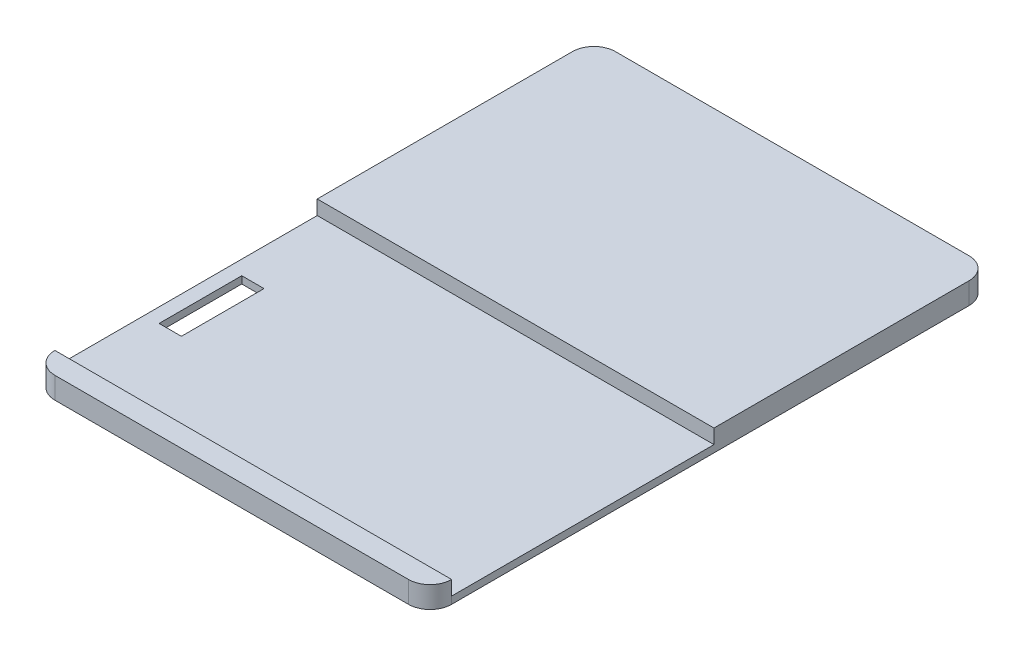
ISO-10303-21;
HEADER;
FILE_DESCRIPTION(('STEP AP214'),'2;1');
FILE_NAME('part.step','',(''),(''),'','','');
FILE_SCHEMA(('AUTOMOTIVE_DESIGN { 1 0 10303 214 1 1 1 1 }'));
ENDSEC;
DATA;
#1=APPLICATION_CONTEXT('core data for automotive mechanical design processes');
#2=APPLICATION_PROTOCOL_DEFINITION('international standard','automotive_design',2000,#1);
#3=PRODUCT_CONTEXT('',#1,'mechanical');
#4=PRODUCT('Part','Part','',(#3));
#5=PRODUCT_RELATED_PRODUCT_CATEGORY('part','',(#4));
#6=PRODUCT_DEFINITION_FORMATION('','',#4);
#7=PRODUCT_DEFINITION_CONTEXT('part definition',#1,'design');
#8=PRODUCT_DEFINITION('design','',#6,#7);
#9=PRODUCT_DEFINITION_SHAPE('','',#8);
#10=(LENGTH_UNIT() NAMED_UNIT(*) SI_UNIT(.MILLI.,.METRE.));
#11=(NAMED_UNIT(*) PLANE_ANGLE_UNIT() SI_UNIT($,.RADIAN.));
#12=(NAMED_UNIT(*) SI_UNIT($,.STERADIAN.) SOLID_ANGLE_UNIT());
#13=UNCERTAINTY_MEASURE_WITH_UNIT(LENGTH_MEASURE(1.E-05),#10,'distance_accuracy_value','');
#14=(GEOMETRIC_REPRESENTATION_CONTEXT(3) GLOBAL_UNCERTAINTY_ASSIGNED_CONTEXT((#13)) GLOBAL_UNIT_ASSIGNED_CONTEXT((#10,
#11,#12)) REPRESENTATION_CONTEXT('',''));
#15=CARTESIAN_POINT('',(0.,0.,0.));
#16=DIRECTION('',(0.,0.,1.));
#17=DIRECTION('',(1.,0.,0.));
#18=AXIS2_PLACEMENT_3D('',#15,#16,#17);
#19=CARTESIAN_POINT('',(-24.6,3.,36.));
#20=DIRECTION('',(0.,-1.,0.));
#21=DIRECTION('',(0.,0.,-1.));
#22=AXIS2_PLACEMENT_3D('',#19,#20,#21);
#23=CYLINDRICAL_SURFACE('',#22,3.);
#24=CARTESIAN_POINT('',(-24.6,0.,36.));
#25=DIRECTION('',(0.,1.,0.));
#26=DIRECTION('',(0.,0.,1.));
#27=AXIS2_PLACEMENT_3D('',#24,#25,#26);
#28=CIRCLE('',#27,3.);
#29=CARTESIAN_POINT('',(-24.6,0.,39.));
#30=VERTEX_POINT('',#29);
#31=CARTESIAN_POINT('',(-27.6,0.,36.));
#32=VERTEX_POINT('',#31);
#33=EDGE_CURVE('E236',#30,#32,#28,.F.);
#34=ORIENTED_EDGE('',*,*,#33,.F.);
#35=DIRECTION('',(0.,-1.,0.));
#36=VECTOR('',#35,1.);
#37=CARTESIAN_POINT('',(-24.6,3.,39.));
#38=LINE('',#37,#36);
#39=CARTESIAN_POINT('',(-24.6,3.,39.));
#40=VERTEX_POINT('',#39);
#41=EDGE_CURVE('E11',#40,#30,#38,.T.);
#42=ORIENTED_EDGE('',*,*,#41,.F.);
#43=CARTESIAN_POINT('',(-24.6,3.,36.));
#44=DIRECTION('',(0.,1.,0.));
#45=DIRECTION('',(0.,0.,1.));
#46=AXIS2_PLACEMENT_3D('',#43,#44,#45);
#47=CIRCLE('',#46,3.);
#48=CARTESIAN_POINT('',(-27.6,3.,36.));
#49=VERTEX_POINT('',#48);
#50=EDGE_CURVE('E244',#40,#49,#47,.F.);
#51=ORIENTED_EDGE('',*,*,#50,.T.);
#52=DIRECTION('',(0.,-1.,0.));
#53=VECTOR('',#52,1.);
#54=CARTESIAN_POINT('',(-27.6,3.,36.));
#55=LINE('',#54,#53);
#56=CARTESIAN_POINT('',(-27.6,1.,36.));
#57=VERTEX_POINT('',#56);
#58=EDGE_CURVE('E54',#49,#57,#55,.T.);
#59=ORIENTED_EDGE('',*,*,#58,.T.);
#60=DIRECTION('',(0.,-1.,0.));
#61=VECTOR('',#60,1.);
#62=CARTESIAN_POINT('',(-27.6,1.,36.));
#63=LINE('',#62,#61);
#64=EDGE_CURVE('E75',#57,#32,#63,.T.);
#65=ORIENTED_EDGE('',*,*,#64,.T.);
#66=EDGE_LOOP('',(#34,#42,#51,#59,#65));
#67=FACE_BOUND('',#66,.T.);
#68=ADVANCED_FACE('F35',(#67),#23,.T.);
#69=CARTESIAN_POINT('',(0.,3.,39.));
#70=DIRECTION('',(0.,0.,-1.));
#71=DIRECTION('',(-1.,0.,0.));
#72=AXIS2_PLACEMENT_3D('',#69,#70,#71);
#73=PLANE('',#72);
#74=DIRECTION('',(1.,0.,0.));
#75=VECTOR('',#74,1.);
#76=CARTESIAN_POINT('',(0.,0.,39.));
#77=LINE('',#76,#75);
#78=CARTESIAN_POINT('',(24.6,0.,39.));
#79=VERTEX_POINT('',#78);
#80=EDGE_CURVE('E255',#30,#79,#77,.T.);
#81=ORIENTED_EDGE('',*,*,#80,.T.);
#82=DIRECTION('',(0.,-1.,0.));
#83=VECTOR('',#82,1.);
#84=CARTESIAN_POINT('',(24.6,3.,39.));
#85=LINE('',#84,#83);
#86=CARTESIAN_POINT('',(24.6,3.,39.));
#87=VERTEX_POINT('',#86);
#88=EDGE_CURVE('E42',#87,#79,#85,.T.);
#89=ORIENTED_EDGE('',*,*,#88,.F.);
#90=DIRECTION('',(1.,0.,0.));
#91=VECTOR('',#90,1.);
#92=CARTESIAN_POINT('',(0.,3.,39.));
#93=LINE('',#92,#91);
#94=EDGE_CURVE('E246',#40,#87,#93,.T.);
#95=ORIENTED_EDGE('',*,*,#94,.F.);
#96=ORIENTED_EDGE('',*,*,#41,.T.);
#97=EDGE_LOOP('',(#81,#89,#95,#96));
#98=FACE_BOUND('',#97,.T.);
#99=ADVANCED_FACE('F270',(#98),#73,.F.);
#100=CARTESIAN_POINT('',(24.6,3.,36.));
#101=DIRECTION('',(0.,-1.,0.));
#102=DIRECTION('',(0.,0.,-1.));
#103=AXIS2_PLACEMENT_3D('',#100,#101,#102);
#104=CYLINDRICAL_SURFACE('',#103,3.);
#105=CARTESIAN_POINT('',(24.6,0.,36.));
#106=DIRECTION('',(0.,1.,0.));
#107=DIRECTION('',(0.,0.,1.));
#108=AXIS2_PLACEMENT_3D('',#105,#106,#107);
#109=CIRCLE('',#108,3.);
#110=CARTESIAN_POINT('',(27.6,0.,36.));
#111=VERTEX_POINT('',#110);
#112=EDGE_CURVE('E247',#111,#79,#109,.F.);
#113=ORIENTED_EDGE('',*,*,#112,.F.);
#114=DIRECTION('',(0.,-1.,0.));
#115=VECTOR('',#114,1.);
#116=CARTESIAN_POINT('',(27.6,1.,36.));
#117=LINE('',#116,#115);
#118=CARTESIAN_POINT('',(27.6,1.,36.));
#119=VERTEX_POINT('',#118);
#120=EDGE_CURVE('E231',#119,#111,#117,.T.);
#121=ORIENTED_EDGE('',*,*,#120,.F.);
#122=DIRECTION('',(0.,-1.,0.));
#123=VECTOR('',#122,1.);
#124=CARTESIAN_POINT('',(27.6,3.,36.));
#125=LINE('',#124,#123);
#126=CARTESIAN_POINT('',(27.6,3.,36.));
#127=VERTEX_POINT('',#126);
#128=EDGE_CURVE('E261',#127,#119,#125,.T.);
#129=ORIENTED_EDGE('',*,*,#128,.F.);
#130=CARTESIAN_POINT('',(24.6,3.,36.));
#131=DIRECTION('',(0.,1.,0.));
#132=DIRECTION('',(0.,0.,1.));
#133=AXIS2_PLACEMENT_3D('',#130,#131,#132);
#134=CIRCLE('',#133,3.);
#135=EDGE_CURVE('E249',#127,#87,#134,.F.);
#136=ORIENTED_EDGE('',*,*,#135,.T.);
#137=ORIENTED_EDGE('',*,*,#88,.T.);
#138=EDGE_LOOP('',(#113,#121,#129,#136,#137));
#139=FACE_BOUND('',#138,.T.);
#140=ADVANCED_FACE('F264',(#139),#104,.T.);
#141=CARTESIAN_POINT('',(0.,3.,36.));
#142=DIRECTION('',(0.,0.,-1.));
#143=DIRECTION('',(-1.,0.,0.));
#144=AXIS2_PLACEMENT_3D('',#141,#142,#143);
#145=PLANE('',#144);
#146=DIRECTION('',(1.,0.,0.));
#147=VECTOR('',#146,1.);
#148=CARTESIAN_POINT('',(0.,1.,36.));
#149=LINE('',#148,#147);
#150=EDGE_CURVE('E49',#57,#119,#149,.T.);
#151=ORIENTED_EDGE('',*,*,#150,.F.);
#152=ORIENTED_EDGE('',*,*,#58,.F.);
#153=DIRECTION('',(1.,0.,0.));
#154=VECTOR('',#153,1.);
#155=CARTESIAN_POINT('',(0.,3.,36.));
#156=LINE('',#155,#154);
#157=EDGE_CURVE('E252',#49,#127,#156,.T.);
#158=ORIENTED_EDGE('',*,*,#157,.T.);
#159=ORIENTED_EDGE('',*,*,#128,.T.);
#160=EDGE_LOOP('',(#151,#152,#158,#159));
#161=FACE_BOUND('',#160,.T.);
#162=ADVANCED_FACE('F283',(#161),#145,.T.);
#163=CARTESIAN_POINT('',(0.,3.,0.));
#164=DIRECTION('',(0.,1.,0.));
#165=DIRECTION('',(0.,0.,1.));
#166=AXIS2_PLACEMENT_3D('',#163,#164,#165);
#167=PLANE('',#166);
#168=ORIENTED_EDGE('',*,*,#50,.F.);
#169=ORIENTED_EDGE('',*,*,#94,.T.);
#170=ORIENTED_EDGE('',*,*,#135,.F.);
#171=ORIENTED_EDGE('',*,*,#157,.F.);
#172=EDGE_LOOP('',(#168,#169,#170,#171));
#173=FACE_BOUND('',#172,.T.);
#174=ADVANCED_FACE('F282',(#173),#167,.T.);
#175=CARTESIAN_POINT('',(0.,0.,0.));
#176=DIRECTION('',(0.,1.,0.));
#177=DIRECTION('',(0.,0.,1.));
#178=AXIS2_PLACEMENT_3D('',#175,#176,#177);
#179=PLANE('',#178);
#180=ORIENTED_EDGE('',*,*,#33,.T.);
#181=DIRECTION('',(0.,0.,-1.));
#182=VECTOR('',#181,1.);
#183=CARTESIAN_POINT('',(-27.6,0.,0.));
#184=LINE('',#183,#182);
#185=CARTESIAN_POINT('',(-27.6,0.,-36.));
#186=VERTEX_POINT('',#185);
#187=EDGE_CURVE('E228',#32,#186,#184,.T.);
#188=ORIENTED_EDGE('',*,*,#187,.T.);
#189=CARTESIAN_POINT('',(-24.6,0.,-36.));
#190=DIRECTION('',(0.,1.,0.));
#191=DIRECTION('',(0.,0.,1.));
#192=AXIS2_PLACEMENT_3D('',#189,#190,#191);
#193=CIRCLE('',#192,3.);
#194=CARTESIAN_POINT('',(-24.6,0.,-39.));
#195=VERTEX_POINT('',#194);
#196=EDGE_CURVE('E174',#195,#186,#193,.T.);
#197=ORIENTED_EDGE('',*,*,#196,.F.);
#198=DIRECTION('',(1.,0.,0.));
#199=VECTOR('',#198,1.);
#200=CARTESIAN_POINT('',(0.,0.,-39.));
#201=LINE('',#200,#199);
#202=CARTESIAN_POINT('',(24.6,0.,-39.));
#203=VERTEX_POINT('',#202);
#204=EDGE_CURVE('E151',#195,#203,#201,.T.);
#205=ORIENTED_EDGE('',*,*,#204,.T.);
#206=CARTESIAN_POINT('',(24.6,0.,-36.));
#207=DIRECTION('',(0.,1.,0.));
#208=DIRECTION('',(0.,0.,1.));
#209=AXIS2_PLACEMENT_3D('',#206,#207,#208);
#210=CIRCLE('',#209,3.);
#211=CARTESIAN_POINT('',(27.6,0.,-36.));
#212=VERTEX_POINT('',#211);
#213=EDGE_CURVE('E171',#212,#203,#210,.T.);
#214=ORIENTED_EDGE('',*,*,#213,.F.);
#215=DIRECTION('',(0.,0.,-1.));
#216=VECTOR('',#215,1.);
#217=CARTESIAN_POINT('',(27.6,0.,0.));
#218=LINE('',#217,#216);
#219=EDGE_CURVE('E201',#111,#212,#218,.T.);
#220=ORIENTED_EDGE('',*,*,#219,.F.);
#221=ORIENTED_EDGE('',*,*,#112,.T.);
#222=ORIENTED_EDGE('',*,*,#80,.F.);
#223=EDGE_LOOP('',(#180,#188,#197,#205,#214,#220,#221,#222));
#224=FACE_BOUND('',#223,.T.);
#225=DIRECTION('',(0.,0.,1.));
#226=VECTOR('',#225,1.);
#227=CARTESIAN_POINT('',(-25.6,0.,0.));
#228=LINE('',#227,#226);
#229=CARTESIAN_POINT('',(-25.6,0.,12.));
#230=VERTEX_POINT('',#229);
#231=CARTESIAN_POINT('',(-25.6,0.,23.5));
#232=VERTEX_POINT('',#231);
#233=EDGE_CURVE('E155',#230,#232,#228,.T.);
#234=ORIENTED_EDGE('',*,*,#233,.T.);
#235=DIRECTION('',(-1.,0.,0.));
#236=VECTOR('',#235,1.);
#237=CARTESIAN_POINT('',(0.,0.,23.5));
#238=LINE('',#237,#236);
#239=CARTESIAN_POINT('',(-22.5,0.,23.5));
#240=VERTEX_POINT('',#239);
#241=EDGE_CURVE('E225',#240,#232,#238,.T.);
#242=ORIENTED_EDGE('',*,*,#241,.F.);
#243=DIRECTION('',(0.,0.,1.));
#244=VECTOR('',#243,1.);
#245=CARTESIAN_POINT('',(-22.5,0.,0.));
#246=LINE('',#245,#244);
#247=CARTESIAN_POINT('',(-22.5,0.,12.));
#248=VERTEX_POINT('',#247);
#249=EDGE_CURVE('E223',#248,#240,#246,.T.);
#250=ORIENTED_EDGE('',*,*,#249,.F.);
#251=DIRECTION('',(-1.,0.,0.));
#252=VECTOR('',#251,1.);
#253=CARTESIAN_POINT('',(0.,0.,12.));
#254=LINE('',#253,#252);
#255=EDGE_CURVE('E220',#248,#230,#254,.T.);
#256=ORIENTED_EDGE('',*,*,#255,.T.);
#257=EDGE_LOOP('',(#234,#242,#250,#256));
#258=FACE_BOUND('',#257,.T.);
#259=ADVANCED_FACE('F272',(#224,#258),#179,.F.);
#260=CARTESIAN_POINT('',(-27.6,1.,0.));
#261=DIRECTION('',(-1.,0.,0.));
#262=DIRECTION('',(0.,0.,1.));
#263=AXIS2_PLACEMENT_3D('',#260,#261,#262);
#264=PLANE('',#263);
#265=ORIENTED_EDGE('',*,*,#187,.F.);
#266=ORIENTED_EDGE('',*,*,#64,.F.);
#267=DIRECTION('',(0.,0.,-1.));
#268=VECTOR('',#267,1.);
#269=CARTESIAN_POINT('',(-27.6,1.,0.));
#270=LINE('',#269,#268);
#271=CARTESIAN_POINT('',(-27.6,1.,-0.5));
#272=VERTEX_POINT('',#271);
#273=EDGE_CURVE('E211',#57,#272,#270,.T.);
#274=ORIENTED_EDGE('',*,*,#273,.T.);
#275=DIRECTION('',(0.,-1.,0.));
#276=VECTOR('',#275,1.);
#277=CARTESIAN_POINT('',(-27.6,3.,-0.5));
#278=LINE('',#277,#276);
#279=CARTESIAN_POINT('',(-27.6,3.,-0.5));
#280=VERTEX_POINT('',#279);
#281=EDGE_CURVE('E193',#280,#272,#278,.T.);
#282=ORIENTED_EDGE('',*,*,#281,.F.);
#283=DIRECTION('',(0.,0.,-1.));
#284=VECTOR('',#283,1.);
#285=CARTESIAN_POINT('',(-27.6,3.,0.));
#286=LINE('',#285,#284);
#287=CARTESIAN_POINT('',(-27.6,3.,-36.));
#288=VERTEX_POINT('',#287);
#289=EDGE_CURVE('E165',#280,#288,#286,.T.);
#290=ORIENTED_EDGE('',*,*,#289,.T.);
#291=DIRECTION('',(0.,-1.,0.));
#292=VECTOR('',#291,1.);
#293=CARTESIAN_POINT('',(-27.6,3.,-36.));
#294=LINE('',#293,#292);
#295=EDGE_CURVE('E156',#288,#186,#294,.T.);
#296=ORIENTED_EDGE('',*,*,#295,.T.);
#297=EDGE_LOOP('',(#265,#266,#274,#282,#290,#296));
#298=FACE_BOUND('',#297,.T.);
#299=ADVANCED_FACE('F299',(#298),#264,.T.);
#300=CARTESIAN_POINT('',(-25.6,1.,0.));
#301=DIRECTION('',(1.,0.,0.));
#302=DIRECTION('',(0.,0.,-1.));
#303=AXIS2_PLACEMENT_3D('',#300,#301,#302);
#304=PLANE('',#303);
#305=ORIENTED_EDGE('',*,*,#233,.F.);
#306=DIRECTION('',(0.,-1.,0.));
#307=VECTOR('',#306,1.);
#308=CARTESIAN_POINT('',(-25.6,1.,12.));
#309=LINE('',#308,#307);
#310=CARTESIAN_POINT('',(-25.6,1.,12.));
#311=VERTEX_POINT('',#310);
#312=EDGE_CURVE('E234',#311,#230,#309,.T.);
#313=ORIENTED_EDGE('',*,*,#312,.F.);
#314=DIRECTION('',(0.,0.,1.));
#315=VECTOR('',#314,1.);
#316=CARTESIAN_POINT('',(-25.6,1.,0.));
#317=LINE('',#316,#315);
#318=CARTESIAN_POINT('',(-25.6,1.,23.5));
#319=VERTEX_POINT('',#318);
#320=EDGE_CURVE('E197',#311,#319,#317,.T.);
#321=ORIENTED_EDGE('',*,*,#320,.T.);
#322=DIRECTION('',(0.,-1.,0.));
#323=VECTOR('',#322,1.);
#324=CARTESIAN_POINT('',(-25.6,1.,23.5));
#325=LINE('',#324,#323);
#326=EDGE_CURVE('E217',#319,#232,#325,.T.);
#327=ORIENTED_EDGE('',*,*,#326,.T.);
#328=EDGE_LOOP('',(#305,#313,#321,#327));
#329=FACE_BOUND('',#328,.T.);
#330=ADVANCED_FACE('F330',(#329),#304,.T.);
#331=CARTESIAN_POINT('',(0.,1.,12.));
#332=DIRECTION('',(0.,0.,1.));
#333=DIRECTION('',(1.,0.,0.));
#334=AXIS2_PLACEMENT_3D('',#331,#332,#333);
#335=PLANE('',#334);
#336=ORIENTED_EDGE('',*,*,#255,.F.);
#337=DIRECTION('',(0.,-1.,0.));
#338=VECTOR('',#337,1.);
#339=CARTESIAN_POINT('',(-22.5,1.,12.));
#340=LINE('',#339,#338);
#341=CARTESIAN_POINT('',(-22.5,1.,12.));
#342=VERTEX_POINT('',#341);
#343=EDGE_CURVE('E241',#342,#248,#340,.T.);
#344=ORIENTED_EDGE('',*,*,#343,.F.);
#345=DIRECTION('',(-1.,0.,0.));
#346=VECTOR('',#345,1.);
#347=CARTESIAN_POINT('',(0.,1.,12.));
#348=LINE('',#347,#346);
#349=EDGE_CURVE('E200',#342,#311,#348,.T.);
#350=ORIENTED_EDGE('',*,*,#349,.T.);
#351=ORIENTED_EDGE('',*,*,#312,.T.);
#352=EDGE_LOOP('',(#336,#344,#350,#351));
#353=FACE_BOUND('',#352,.T.);
#354=ADVANCED_FACE('F337',(#353),#335,.T.);
#355=CARTESIAN_POINT('',(-22.5,1.,0.));
#356=DIRECTION('',(1.,0.,0.));
#357=DIRECTION('',(0.,0.,-1.));
#358=AXIS2_PLACEMENT_3D('',#355,#356,#357);
#359=PLANE('',#358);
#360=ORIENTED_EDGE('',*,*,#249,.T.);
#361=DIRECTION('',(0.,-1.,0.));
#362=VECTOR('',#361,1.);
#363=CARTESIAN_POINT('',(-22.5,1.,23.5));
#364=LINE('',#363,#362);
#365=CARTESIAN_POINT('',(-22.5,1.,23.5));
#366=VERTEX_POINT('',#365);
#367=EDGE_CURVE('E238',#366,#240,#364,.T.);
#368=ORIENTED_EDGE('',*,*,#367,.F.);
#369=DIRECTION('',(0.,0.,1.));
#370=VECTOR('',#369,1.);
#371=CARTESIAN_POINT('',(-22.5,1.,0.));
#372=LINE('',#371,#370);
#373=EDGE_CURVE('E204',#342,#366,#372,.T.);
#374=ORIENTED_EDGE('',*,*,#373,.F.);
#375=ORIENTED_EDGE('',*,*,#343,.T.);
#376=EDGE_LOOP('',(#360,#368,#374,#375));
#377=FACE_BOUND('',#376,.T.);
#378=ADVANCED_FACE('F333',(#377),#359,.F.);
#379=CARTESIAN_POINT('',(0.,1.,23.5));
#380=DIRECTION('',(0.,0.,1.));
#381=DIRECTION('',(1.,0.,0.));
#382=AXIS2_PLACEMENT_3D('',#379,#380,#381);
#383=PLANE('',#382);
#384=ORIENTED_EDGE('',*,*,#241,.T.);
#385=ORIENTED_EDGE('',*,*,#326,.F.);
#386=DIRECTION('',(-1.,0.,0.));
#387=VECTOR('',#386,1.);
#388=CARTESIAN_POINT('',(0.,1.,23.5));
#389=LINE('',#388,#387);
#390=EDGE_CURVE('E206',#366,#319,#389,.T.);
#391=ORIENTED_EDGE('',*,*,#390,.F.);
#392=ORIENTED_EDGE('',*,*,#367,.T.);
#393=EDGE_LOOP('',(#384,#385,#391,#392));
#394=FACE_BOUND('',#393,.T.);
#395=ADVANCED_FACE('F327',(#394),#383,.F.);
#396=CARTESIAN_POINT('',(27.6,1.,0.));
#397=DIRECTION('',(-1.,0.,0.));
#398=DIRECTION('',(0.,0.,1.));
#399=AXIS2_PLACEMENT_3D('',#396,#397,#398);
#400=PLANE('',#399);
#401=ORIENTED_EDGE('',*,*,#219,.T.);
#402=DIRECTION('',(0.,-1.,0.));
#403=VECTOR('',#402,1.);
#404=CARTESIAN_POINT('',(27.6,3.,-36.));
#405=LINE('',#404,#403);
#406=CARTESIAN_POINT('',(27.6,3.,-36.));
#407=VERTEX_POINT('',#406);
#408=EDGE_CURVE('E187',#407,#212,#405,.T.);
#409=ORIENTED_EDGE('',*,*,#408,.F.);
#410=DIRECTION('',(0.,0.,-1.));
#411=VECTOR('',#410,1.);
#412=CARTESIAN_POINT('',(27.6,3.,0.));
#413=LINE('',#412,#411);
#414=CARTESIAN_POINT('',(27.6,3.,-0.5));
#415=VERTEX_POINT('',#414);
#416=EDGE_CURVE('E180',#415,#407,#413,.T.);
#417=ORIENTED_EDGE('',*,*,#416,.F.);
#418=DIRECTION('',(0.,-1.,0.));
#419=VECTOR('',#418,1.);
#420=CARTESIAN_POINT('',(27.6,3.,-0.5));
#421=LINE('',#420,#419);
#422=CARTESIAN_POINT('',(27.6,1.,-0.5));
#423=VERTEX_POINT('',#422);
#424=EDGE_CURVE('E190',#415,#423,#421,.T.);
#425=ORIENTED_EDGE('',*,*,#424,.T.);
#426=DIRECTION('',(0.,0.,-1.));
#427=VECTOR('',#426,1.);
#428=CARTESIAN_POINT('',(27.6,1.,0.));
#429=LINE('',#428,#427);
#430=EDGE_CURVE('E215',#119,#423,#429,.T.);
#431=ORIENTED_EDGE('',*,*,#430,.F.);
#432=ORIENTED_EDGE('',*,*,#120,.T.);
#433=EDGE_LOOP('',(#401,#409,#417,#425,#431,#432));
#434=FACE_BOUND('',#433,.T.);
#435=ADVANCED_FACE('F278',(#434),#400,.F.);
#436=CARTESIAN_POINT('',(0.,1.,0.));
#437=DIRECTION('',(0.,1.,0.));
#438=DIRECTION('',(0.,0.,1.));
#439=AXIS2_PLACEMENT_3D('',#436,#437,#438);
#440=PLANE('',#439);
#441=ORIENTED_EDGE('',*,*,#320,.F.);
#442=ORIENTED_EDGE('',*,*,#349,.F.);
#443=ORIENTED_EDGE('',*,*,#373,.T.);
#444=ORIENTED_EDGE('',*,*,#390,.T.);
#445=EDGE_LOOP('',(#441,#442,#443,#444));
#446=FACE_BOUND('',#445,.T.);
#447=DIRECTION('',(1.,0.,0.));
#448=VECTOR('',#447,1.);
#449=CARTESIAN_POINT('',(0.,1.,-0.5));
#450=LINE('',#449,#448);
#451=EDGE_CURVE('E208',#272,#423,#450,.T.);
#452=ORIENTED_EDGE('',*,*,#451,.F.);
#453=ORIENTED_EDGE('',*,*,#273,.F.);
#454=ORIENTED_EDGE('',*,*,#150,.T.);
#455=ORIENTED_EDGE('',*,*,#430,.T.);
#456=EDGE_LOOP('',(#452,#453,#454,#455));
#457=FACE_BOUND('',#456,.T.);
#458=ADVANCED_FACE('F318',(#446,#457),#440,.T.);
#459=CARTESIAN_POINT('',(0.,3.,-0.5));
#460=DIRECTION('',(0.,0.,-1.));
#461=DIRECTION('',(-1.,0.,0.));
#462=AXIS2_PLACEMENT_3D('',#459,#460,#461);
#463=PLANE('',#462);
#464=ORIENTED_EDGE('',*,*,#281,.T.);
#465=ORIENTED_EDGE('',*,*,#451,.T.);
#466=ORIENTED_EDGE('',*,*,#424,.F.);
#467=DIRECTION('',(1.,0.,0.));
#468=VECTOR('',#467,1.);
#469=CARTESIAN_POINT('',(0.,3.,-0.5));
#470=LINE('',#469,#468);
#471=EDGE_CURVE('E178',#280,#415,#470,.T.);
#472=ORIENTED_EDGE('',*,*,#471,.F.);
#473=EDGE_LOOP('',(#464,#465,#466,#472));
#474=FACE_BOUND('',#473,.T.);
#475=ADVANCED_FACE('F305',(#474),#463,.F.);
#476=CARTESIAN_POINT('',(0.,3.,-39.));
#477=DIRECTION('',(0.,0.,-1.));
#478=DIRECTION('',(-1.,0.,0.));
#479=AXIS2_PLACEMENT_3D('',#476,#477,#478);
#480=PLANE('',#479);
#481=ORIENTED_EDGE('',*,*,#204,.F.);
#482=DIRECTION('',(0.,-1.,0.));
#483=VECTOR('',#482,1.);
#484=CARTESIAN_POINT('',(-24.6,3.,-39.));
#485=LINE('',#484,#483);
#486=CARTESIAN_POINT('',(-24.6,3.,-39.));
#487=VERTEX_POINT('',#486);
#488=EDGE_CURVE('E145',#487,#195,#485,.T.);
#489=ORIENTED_EDGE('',*,*,#488,.F.);
#490=DIRECTION('',(1.,0.,0.));
#491=VECTOR('',#490,1.);
#492=CARTESIAN_POINT('',(0.,3.,-39.));
#493=LINE('',#492,#491);
#494=CARTESIAN_POINT('',(24.6,3.,-39.));
#495=VERTEX_POINT('',#494);
#496=EDGE_CURVE('E149',#487,#495,#493,.T.);
#497=ORIENTED_EDGE('',*,*,#496,.T.);
#498=DIRECTION('',(0.,-1.,0.));
#499=VECTOR('',#498,1.);
#500=CARTESIAN_POINT('',(24.6,3.,-39.));
#501=LINE('',#500,#499);
#502=EDGE_CURVE('E183',#495,#203,#501,.T.);
#503=ORIENTED_EDGE('',*,*,#502,.T.);
#504=EDGE_LOOP('',(#481,#489,#497,#503));
#505=FACE_BOUND('',#504,.T.);
#506=ADVANCED_FACE('F147',(#505),#480,.T.);
#507=CARTESIAN_POINT('',(-24.6,3.,-36.));
#508=DIRECTION('',(0.,-1.,0.));
#509=DIRECTION('',(0.,0.,-1.));
#510=AXIS2_PLACEMENT_3D('',#507,#508,#509);
#511=CYLINDRICAL_SURFACE('',#510,3.);
#512=ORIENTED_EDGE('',*,*,#196,.T.);
#513=ORIENTED_EDGE('',*,*,#295,.F.);
#514=CARTESIAN_POINT('',(-24.6,3.,-36.));
#515=DIRECTION('',(0.,1.,0.));
#516=DIRECTION('',(0.,0.,1.));
#517=AXIS2_PLACEMENT_3D('',#514,#515,#516);
#518=CIRCLE('',#517,3.);
#519=EDGE_CURVE('E159',#487,#288,#518,.T.);
#520=ORIENTED_EDGE('',*,*,#519,.F.);
#521=ORIENTED_EDGE('',*,*,#488,.T.);
#522=EDGE_LOOP('',(#512,#513,#520,#521));
#523=FACE_BOUND('',#522,.T.);
#524=ADVANCED_FACE('F160',(#523),#511,.T.);
#525=CARTESIAN_POINT('',(24.6,3.,-36.));
#526=DIRECTION('',(0.,-1.,0.));
#527=DIRECTION('',(0.,0.,-1.));
#528=AXIS2_PLACEMENT_3D('',#525,#526,#527);
#529=CYLINDRICAL_SURFACE('',#528,3.);
#530=ORIENTED_EDGE('',*,*,#213,.T.);
#531=ORIENTED_EDGE('',*,*,#502,.F.);
#532=CARTESIAN_POINT('',(24.6,3.,-36.));
#533=DIRECTION('',(0.,1.,0.));
#534=DIRECTION('',(0.,0.,1.));
#535=AXIS2_PLACEMENT_3D('',#532,#533,#534);
#536=CIRCLE('',#535,3.);
#537=EDGE_CURVE('E169',#407,#495,#536,.T.);
#538=ORIENTED_EDGE('',*,*,#537,.F.);
#539=ORIENTED_EDGE('',*,*,#408,.T.);
#540=EDGE_LOOP('',(#530,#531,#538,#539));
#541=FACE_BOUND('',#540,.T.);
#542=ADVANCED_FACE('F307',(#541),#529,.T.);
#543=CARTESIAN_POINT('',(0.,3.,0.));
#544=DIRECTION('',(0.,1.,0.));
#545=DIRECTION('',(0.,0.,1.));
#546=AXIS2_PLACEMENT_3D('',#543,#544,#545);
#547=PLANE('',#546);
#548=ORIENTED_EDGE('',*,*,#496,.F.);
#549=ORIENTED_EDGE('',*,*,#519,.T.);
#550=ORIENTED_EDGE('',*,*,#289,.F.);
#551=ORIENTED_EDGE('',*,*,#471,.T.);
#552=ORIENTED_EDGE('',*,*,#416,.T.);
#553=ORIENTED_EDGE('',*,*,#537,.T.);
#554=EDGE_LOOP('',(#548,#549,#550,#551,#552,#553));
#555=FACE_BOUND('',#554,.T.);
#556=ADVANCED_FACE('F167',(#555),#547,.T.);
#557=CLOSED_SHELL('',(#68,#99,#140,#162,#174,#259,#299,#330,#354,#378,#395,#435,#458,#475,#506,
#524,#542,#556));
#558=MANIFOLD_SOLID_BREP('B2',#557);
#559=ADVANCED_BREP_SHAPE_REPRESENTATION('',(#18,#558),#14);
#560=SHAPE_DEFINITION_REPRESENTATION(#9,#559);
ENDSEC;
END-ISO-10303-21;
